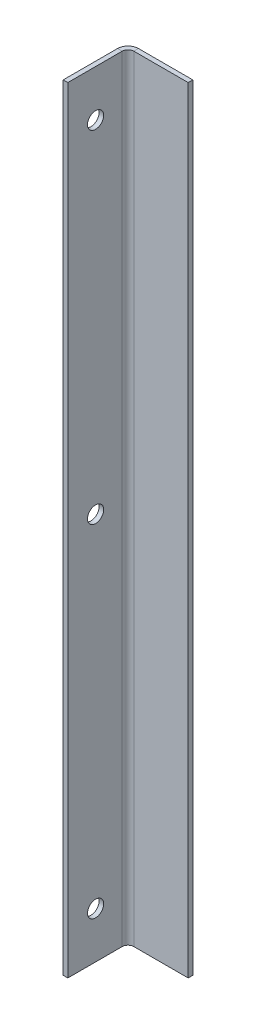
ISO-10303-21;
HEADER;
FILE_DESCRIPTION(('STEP AP214'),'2;1');
FILE_NAME('part.step','',(''),(''),'','','');
FILE_SCHEMA(('AUTOMOTIVE_DESIGN { 1 0 10303 214 1 1 1 1 }'));
ENDSEC;
DATA;
#1=APPLICATION_CONTEXT('core data for automotive mechanical design processes');
#2=APPLICATION_PROTOCOL_DEFINITION('international standard','automotive_design',2000,#1);
#3=PRODUCT_CONTEXT('',#1,'mechanical');
#4=PRODUCT('Part','Part','',(#3));
#5=PRODUCT_RELATED_PRODUCT_CATEGORY('part','',(#4));
#6=PRODUCT_DEFINITION_FORMATION('','',#4);
#7=PRODUCT_DEFINITION_CONTEXT('part definition',#1,'design');
#8=PRODUCT_DEFINITION('design','',#6,#7);
#9=PRODUCT_DEFINITION_SHAPE('','',#8);
#10=(LENGTH_UNIT() NAMED_UNIT(*) SI_UNIT(.MILLI.,.METRE.));
#11=(NAMED_UNIT(*) PLANE_ANGLE_UNIT() SI_UNIT($,.RADIAN.));
#12=(NAMED_UNIT(*) SI_UNIT($,.STERADIAN.) SOLID_ANGLE_UNIT());
#13=UNCERTAINTY_MEASURE_WITH_UNIT(LENGTH_MEASURE(1.E-05),#10,'distance_accuracy_value','');
#14=(GEOMETRIC_REPRESENTATION_CONTEXT(3) GLOBAL_UNCERTAINTY_ASSIGNED_CONTEXT((#13)) GLOBAL_UNIT_ASSIGNED_CONTEXT((#10,
#11,#12)) REPRESENTATION_CONTEXT('',''));
#15=CARTESIAN_POINT('',(0.,0.,0.));
#16=DIRECTION('',(0.,0.,1.));
#17=DIRECTION('',(1.,0.,0.));
#18=AXIS2_PLACEMENT_3D('',#15,#16,#17);
#19=CARTESIAN_POINT('',(-2.,167.5,14.));
#20=DIRECTION('',(0.,1.,0.));
#21=DIRECTION('',(0.,0.,1.));
#22=AXIS2_PLACEMENT_3D('',#19,#20,#21);
#23=PLANE('',#22);
#24=DIRECTION('',(0.,0.,1.));
#25=VECTOR('',#24,1.);
#26=CARTESIAN_POINT('',(0.,167.5,14.));
#27=LINE('',#26,#25);
#28=CARTESIAN_POINT('',(0.,167.5,-9.50000000000001));
#29=VERTEX_POINT('',#28);
#30=CARTESIAN_POINT('',(0.,167.5,14.));
#31=VERTEX_POINT('',#30);
#32=EDGE_CURVE('E109',#29,#31,#27,.T.);
#33=ORIENTED_EDGE('',*,*,#32,.F.);
#34=DIRECTION('',(-1.,0.,0.));
#35=VECTOR('',#34,1.);
#36=CARTESIAN_POINT('',(0.,167.5,-9.50000000000001));
#37=LINE('',#36,#35);
#38=CARTESIAN_POINT('',(-2.00000000000001,167.5,-9.50000000000001));
#39=VERTEX_POINT('',#38);
#40=EDGE_CURVE('E122',#29,#39,#37,.T.);
#41=ORIENTED_EDGE('',*,*,#40,.T.);
#42=DIRECTION('',(0.,0.,1.));
#43=VECTOR('',#42,1.);
#44=CARTESIAN_POINT('',(-2.,167.5,14.));
#45=LINE('',#44,#43);
#46=CARTESIAN_POINT('',(-2.,167.5,14.));
#47=VERTEX_POINT('',#46);
#48=EDGE_CURVE('E114',#39,#47,#45,.T.);
#49=ORIENTED_EDGE('',*,*,#48,.T.);
#50=DIRECTION('',(1.,0.,0.));
#51=VECTOR('',#50,1.);
#52=CARTESIAN_POINT('',(-2.,167.5,14.));
#53=LINE('',#52,#51);
#54=EDGE_CURVE('E64',#47,#31,#53,.T.);
#55=ORIENTED_EDGE('',*,*,#54,.T.);
#56=EDGE_LOOP('',(#33,#41,#49,#55));
#57=FACE_BOUND('',#56,.T.);
#58=ADVANCED_FACE('F61',(#57),#23,.T.);
#59=CARTESIAN_POINT('',(-2.,0.,0.));
#60=DIRECTION('',(-1.,0.,0.));
#61=DIRECTION('',(0.,0.,1.));
#62=AXIS2_PLACEMENT_3D('',#59,#60,#61);
#63=PLANE('',#62);
#64=CARTESIAN_POINT('',(-2.,4.44089209850063E-13,1.99999999999998));
#65=DIRECTION('',(-1.,0.,0.));
#66=DIRECTION('',(0.,0.,1.));
#67=AXIS2_PLACEMENT_3D('',#64,#65,#66);
#68=CIRCLE('',#67,3.5);
#69=CARTESIAN_POINT('',(-2.,4.44089209850063E-13,5.49999999999999));
#70=VERTEX_POINT('',#69);
#71=EDGE_CURVE('E189',#70,#70,#68,.T.);
#72=ORIENTED_EDGE('',*,*,#71,.F.);
#73=EDGE_LOOP('',(#72));
#74=FACE_BOUND('',#73,.T.);
#75=CARTESIAN_POINT('',(-2.,-147.5,1.99999999999998));
#76=DIRECTION('',(-1.,0.,0.));
#77=DIRECTION('',(0.,0.,1.));
#78=AXIS2_PLACEMENT_3D('',#75,#76,#77);
#79=CIRCLE('',#78,3.5);
#80=CARTESIAN_POINT('',(-2.,-147.5,5.49999999999999));
#81=VERTEX_POINT('',#80);
#82=EDGE_CURVE('E183',#81,#81,#79,.F.);
#83=ORIENTED_EDGE('',*,*,#82,.T.);
#84=EDGE_LOOP('',(#83));
#85=FACE_BOUND('',#84,.T.);
#86=CARTESIAN_POINT('',(-2.,147.5,1.99999999999998));
#87=DIRECTION('',(-1.,0.,0.));
#88=DIRECTION('',(0.,0.,1.));
#89=AXIS2_PLACEMENT_3D('',#86,#87,#88);
#90=CIRCLE('',#89,3.5);
#91=CARTESIAN_POINT('',(-2.,147.5,5.49999999999999));
#92=VERTEX_POINT('',#91);
#93=EDGE_CURVE('E147',#92,#92,#90,.T.);
#94=ORIENTED_EDGE('',*,*,#93,.F.);
#95=EDGE_LOOP('',(#94));
#96=FACE_BOUND('',#95,.T.);
#97=ORIENTED_EDGE('',*,*,#48,.F.);
#98=DIRECTION('',(0.,1.,0.));
#99=VECTOR('',#98,1.);
#100=CARTESIAN_POINT('',(-2.00000000000001,167.5,-9.50000000000001));
#101=LINE('',#100,#99);
#102=CARTESIAN_POINT('',(-2.,-167.5,-9.50000000000001));
#103=VERTEX_POINT('',#102);
#104=EDGE_CURVE('E139',#39,#103,#101,.F.);
#105=ORIENTED_EDGE('',*,*,#104,.T.);
#106=DIRECTION('',(0.,0.,-1.));
#107=VECTOR('',#106,1.);
#108=CARTESIAN_POINT('',(-2.,-167.5,14.));
#109=LINE('',#108,#107);
#110=CARTESIAN_POINT('',(-2.,-167.5,14.));
#111=VERTEX_POINT('',#110);
#112=EDGE_CURVE('E119',#111,#103,#109,.T.);
#113=ORIENTED_EDGE('',*,*,#112,.F.);
#114=DIRECTION('',(0.,-1.,0.));
#115=VECTOR('',#114,1.);
#116=CARTESIAN_POINT('',(-2.,-167.5,14.));
#117=LINE('',#116,#115);
#118=EDGE_CURVE('E99',#47,#111,#117,.T.);
#119=ORIENTED_EDGE('',*,*,#118,.F.);
#120=EDGE_LOOP('',(#97,#105,#113,#119));
#121=FACE_BOUND('',#120,.T.);
#122=ADVANCED_FACE('F200',(#74,#85,#96,#121),#63,.T.);
#123=CARTESIAN_POINT('',(0.,0.,0.));
#124=DIRECTION('',(-1.,0.,0.));
#125=DIRECTION('',(0.,0.,1.));
#126=AXIS2_PLACEMENT_3D('',#123,#124,#125);
#127=PLANE('',#126);
#128=CARTESIAN_POINT('',(0.,4.44089209850063E-13,1.99999999999998));
#129=DIRECTION('',(1.,0.,0.));
#130=DIRECTION('',(0.,0.,-1.));
#131=AXIS2_PLACEMENT_3D('',#128,#129,#130);
#132=CIRCLE('',#131,3.5);
#133=CARTESIAN_POINT('',(0.,4.44089209850063E-13,-1.50000000000002));
#134=VERTEX_POINT('',#133);
#135=EDGE_CURVE('E192',#134,#134,#132,.T.);
#136=ORIENTED_EDGE('',*,*,#135,.F.);
#137=EDGE_LOOP('',(#136));
#138=FACE_BOUND('',#137,.T.);
#139=CARTESIAN_POINT('',(0.,-147.5,1.99999999999998));
#140=DIRECTION('',(-1.,0.,0.));
#141=DIRECTION('',(0.,0.,-1.));
#142=AXIS2_PLACEMENT_3D('',#139,#140,#141);
#143=CIRCLE('',#142,3.5);
#144=CARTESIAN_POINT('',(0.,-147.5,-1.50000000000002));
#145=VERTEX_POINT('',#144);
#146=EDGE_CURVE('E186',#145,#145,#143,.T.);
#147=ORIENTED_EDGE('',*,*,#146,.T.);
#148=EDGE_LOOP('',(#147));
#149=FACE_BOUND('',#148,.T.);
#150=CARTESIAN_POINT('',(0.,147.5,1.99999999999998));
#151=DIRECTION('',(1.,0.,0.));
#152=DIRECTION('',(0.,0.,-1.));
#153=AXIS2_PLACEMENT_3D('',#150,#151,#152);
#154=CIRCLE('',#153,3.5);
#155=CARTESIAN_POINT('',(0.,147.5,-1.50000000000002));
#156=VERTEX_POINT('',#155);
#157=EDGE_CURVE('E180',#156,#156,#154,.T.);
#158=ORIENTED_EDGE('',*,*,#157,.F.);
#159=EDGE_LOOP('',(#158));
#160=FACE_BOUND('',#159,.T.);
#161=DIRECTION('',(0.,1.,0.));
#162=VECTOR('',#161,1.);
#163=CARTESIAN_POINT('',(0.,167.5,-9.50000000000001));
#164=LINE('',#163,#162);
#165=CARTESIAN_POINT('',(0.,-167.5,-9.50000000000001));
#166=VERTEX_POINT('',#165);
#167=EDGE_CURVE('E129',#29,#166,#164,.F.);
#168=ORIENTED_EDGE('',*,*,#167,.F.);
#169=ORIENTED_EDGE('',*,*,#32,.T.);
#170=DIRECTION('',(0.,-1.,0.));
#171=VECTOR('',#170,1.);
#172=CARTESIAN_POINT('',(0.,-167.5,14.));
#173=LINE('',#172,#171);
#174=CARTESIAN_POINT('',(0.,-167.5,14.));
#175=VERTEX_POINT('',#174);
#176=EDGE_CURVE('E97',#31,#175,#173,.T.);
#177=ORIENTED_EDGE('',*,*,#176,.T.);
#178=DIRECTION('',(0.,0.,-1.));
#179=VECTOR('',#178,1.);
#180=CARTESIAN_POINT('',(0.,-167.5,14.));
#181=LINE('',#180,#179);
#182=EDGE_CURVE('E106',#175,#166,#181,.T.);
#183=ORIENTED_EDGE('',*,*,#182,.T.);
#184=EDGE_LOOP('',(#168,#169,#177,#183));
#185=FACE_BOUND('',#184,.T.);
#186=ADVANCED_FACE('F104',(#138,#149,#160,#185),#127,.F.);
#187=CARTESIAN_POINT('',(-2.,-167.5,14.));
#188=DIRECTION('',(0.,-1.,0.));
#189=DIRECTION('',(0.,0.,-1.));
#190=AXIS2_PLACEMENT_3D('',#187,#188,#189);
#191=PLANE('',#190);
#192=DIRECTION('',(-1.,0.,0.));
#193=VECTOR('',#192,1.);
#194=CARTESIAN_POINT('',(0.,-167.5,-9.50000000000001));
#195=LINE('',#194,#193);
#196=EDGE_CURVE('E113',#166,#103,#195,.T.);
#197=ORIENTED_EDGE('',*,*,#196,.F.);
#198=ORIENTED_EDGE('',*,*,#182,.F.);
#199=DIRECTION('',(1.,0.,0.));
#200=VECTOR('',#199,1.);
#201=CARTESIAN_POINT('',(-2.,-167.5,14.));
#202=LINE('',#201,#200);
#203=EDGE_CURVE('E13',#111,#175,#202,.T.);
#204=ORIENTED_EDGE('',*,*,#203,.F.);
#205=ORIENTED_EDGE('',*,*,#112,.T.);
#206=EDGE_LOOP('',(#197,#198,#204,#205));
#207=FACE_BOUND('',#206,.T.);
#208=ADVANCED_FACE('F112',(#207),#191,.T.);
#209=CARTESIAN_POINT('',(-2.,-167.5,14.));
#210=DIRECTION('',(0.,0.,1.));
#211=DIRECTION('',(1.,0.,0.));
#212=AXIS2_PLACEMENT_3D('',#209,#210,#211);
#213=PLANE('',#212);
#214=ORIENTED_EDGE('',*,*,#176,.F.);
#215=ORIENTED_EDGE('',*,*,#54,.F.);
#216=ORIENTED_EDGE('',*,*,#118,.T.);
#217=ORIENTED_EDGE('',*,*,#203,.T.);
#218=EDGE_LOOP('',(#214,#215,#216,#217));
#219=FACE_BOUND('',#218,.T.);
#220=ADVANCED_FACE('F95',(#219),#213,.T.);
#221=CARTESIAN_POINT('',(2.49999999999999,-167.5,-9.50000000000001));
#222=DIRECTION('',(0.,-1.,0.));
#223=DIRECTION('',(0.,0.,-1.));
#224=AXIS2_PLACEMENT_3D('',#221,#222,#223);
#225=PLANE('',#224);
#226=DIRECTION('',(0.,0.,1.));
#227=VECTOR('',#226,1.);
#228=CARTESIAN_POINT('',(2.49999999999999,-167.5,-14.));
#229=LINE('',#228,#227);
#230=CARTESIAN_POINT('',(2.49999999999998,-167.5,-12.));
#231=VERTEX_POINT('',#230);
#232=CARTESIAN_POINT('',(2.49999999999998,-167.5,-14.));
#233=VERTEX_POINT('',#232);
#234=EDGE_CURVE('E143',#231,#233,#229,.F.);
#235=ORIENTED_EDGE('',*,*,#234,.F.);
#236=CARTESIAN_POINT('',(2.49999999999999,-167.5,-9.50000000000001));
#237=DIRECTION('',(0.,1.,0.));
#238=DIRECTION('',(0.,0.,1.));
#239=AXIS2_PLACEMENT_3D('',#236,#237,#238);
#240=CIRCLE('',#239,2.5);
#241=EDGE_CURVE('E133',#166,#231,#240,.F.);
#242=ORIENTED_EDGE('',*,*,#241,.F.);
#243=ORIENTED_EDGE('',*,*,#196,.T.);
#244=CARTESIAN_POINT('',(2.49999999999999,-167.5,-9.50000000000001));
#245=DIRECTION('',(0.,1.,0.));
#246=DIRECTION('',(0.,0.,1.));
#247=AXIS2_PLACEMENT_3D('',#244,#245,#246);
#248=CIRCLE('',#247,4.5);
#249=EDGE_CURVE('E75',#103,#233,#248,.F.);
#250=ORIENTED_EDGE('',*,*,#249,.T.);
#251=EDGE_LOOP('',(#235,#242,#243,#250));
#252=FACE_BOUND('',#251,.T.);
#253=ADVANCED_FACE('F280',(#252),#225,.T.);
#254=CARTESIAN_POINT('',(2.49999999999999,167.5,-9.50000000000001));
#255=DIRECTION('',(0.,-1.,0.));
#256=DIRECTION('',(0.,0.,-1.));
#257=AXIS2_PLACEMENT_3D('',#254,#255,#256);
#258=PLANE('',#257);
#259=CARTESIAN_POINT('',(2.49999999999999,167.5,-9.50000000000001));
#260=DIRECTION('',(0.,1.,0.));
#261=DIRECTION('',(0.,0.,1.));
#262=AXIS2_PLACEMENT_3D('',#259,#260,#261);
#263=CIRCLE('',#262,2.5);
#264=CARTESIAN_POINT('',(2.49999999999998,167.5,-12.));
#265=VERTEX_POINT('',#264);
#266=EDGE_CURVE('E126',#265,#29,#263,.T.);
#267=ORIENTED_EDGE('',*,*,#266,.F.);
#268=DIRECTION('',(0.,0.,1.));
#269=VECTOR('',#268,1.);
#270=CARTESIAN_POINT('',(2.49999999999999,167.5,-12.));
#271=LINE('',#270,#269);
#272=CARTESIAN_POINT('',(2.49999999999999,167.5,-14.));
#273=VERTEX_POINT('',#272);
#274=EDGE_CURVE('E150',#265,#273,#271,.F.);
#275=ORIENTED_EDGE('',*,*,#274,.T.);
#276=CARTESIAN_POINT('',(2.49999999999999,167.5,-9.50000000000001));
#277=DIRECTION('',(0.,1.,0.));
#278=DIRECTION('',(0.,0.,1.));
#279=AXIS2_PLACEMENT_3D('',#276,#277,#278);
#280=CIRCLE('',#279,4.5);
#281=EDGE_CURVE('E136',#273,#39,#280,.T.);
#282=ORIENTED_EDGE('',*,*,#281,.T.);
#283=ORIENTED_EDGE('',*,*,#40,.F.);
#284=EDGE_LOOP('',(#267,#275,#282,#283));
#285=FACE_BOUND('',#284,.T.);
#286=ADVANCED_FACE('F262',(#285),#258,.F.);
#287=CARTESIAN_POINT('',(2.49999999999999,167.5,-9.50000000000001));
#288=DIRECTION('',(0.,1.,0.));
#289=DIRECTION('',(0.,0.,-1.));
#290=AXIS2_PLACEMENT_3D('',#287,#288,#289);
#291=CYLINDRICAL_SURFACE('',#290,4.5);
#292=ORIENTED_EDGE('',*,*,#104,.F.);
#293=ORIENTED_EDGE('',*,*,#281,.F.);
#294=DIRECTION('',(0.,1.,0.));
#295=VECTOR('',#294,1.);
#296=CARTESIAN_POINT('',(2.49999999999999,-167.5,-14.));
#297=LINE('',#296,#295);
#298=EDGE_CURVE('E153',#273,#233,#297,.F.);
#299=ORIENTED_EDGE('',*,*,#298,.T.);
#300=ORIENTED_EDGE('',*,*,#249,.F.);
#301=EDGE_LOOP('',(#292,#293,#299,#300));
#302=FACE_BOUND('',#301,.T.);
#303=ADVANCED_FACE('F260',(#302),#291,.T.);
#304=CARTESIAN_POINT('',(2.49999999999999,167.5,-9.50000000000001));
#305=DIRECTION('',(0.,1.,0.));
#306=DIRECTION('',(0.,0.,-1.));
#307=AXIS2_PLACEMENT_3D('',#304,#305,#306);
#308=CYLINDRICAL_SURFACE('',#307,2.5);
#309=ORIENTED_EDGE('',*,*,#167,.T.);
#310=ORIENTED_EDGE('',*,*,#241,.T.);
#311=DIRECTION('',(0.,1.,0.));
#312=VECTOR('',#311,1.);
#313=CARTESIAN_POINT('',(2.49999999999999,-167.5,-12.));
#314=LINE('',#313,#312);
#315=EDGE_CURVE('E146',#231,#265,#314,.T.);
#316=ORIENTED_EDGE('',*,*,#315,.T.);
#317=ORIENTED_EDGE('',*,*,#266,.T.);
#318=EDGE_LOOP('',(#309,#310,#316,#317));
#319=FACE_BOUND('',#318,.T.);
#320=ADVANCED_FACE('F279',(#319),#308,.F.);
#321=CARTESIAN_POINT('',(26.,167.5,-14.0000000000001));
#322=DIRECTION('',(0.,-1.,0.));
#323=DIRECTION('',(0.,0.,-1.));
#324=AXIS2_PLACEMENT_3D('',#321,#322,#323);
#325=PLANE('',#324);
#326=ORIENTED_EDGE('',*,*,#274,.F.);
#327=DIRECTION('',(-1.,0.,0.));
#328=VECTOR('',#327,1.);
#329=CARTESIAN_POINT('',(26.,167.5,-12.0000000000001));
#330=LINE('',#329,#328);
#331=CARTESIAN_POINT('',(26.,167.5,-12.0000000000001));
#332=VERTEX_POINT('',#331);
#333=EDGE_CURVE('E155',#265,#332,#330,.F.);
#334=ORIENTED_EDGE('',*,*,#333,.T.);
#335=DIRECTION('',(0.,0.,1.));
#336=VECTOR('',#335,1.);
#337=CARTESIAN_POINT('',(26.,167.5,-14.0000000000001));
#338=LINE('',#337,#336);
#339=CARTESIAN_POINT('',(26.,167.5,-14.0000000000001));
#340=VERTEX_POINT('',#339);
#341=EDGE_CURVE('E130',#340,#332,#338,.T.);
#342=ORIENTED_EDGE('',*,*,#341,.F.);
#343=DIRECTION('',(1.,0.,0.));
#344=VECTOR('',#343,1.);
#345=CARTESIAN_POINT('',(0.,167.5,-14.));
#346=LINE('',#345,#344);
#347=EDGE_CURVE('E164',#273,#340,#346,.T.);
#348=ORIENTED_EDGE('',*,*,#347,.F.);
#349=EDGE_LOOP('',(#326,#334,#342,#348));
#350=FACE_BOUND('',#349,.T.);
#351=ADVANCED_FACE('F271',(#350),#325,.F.);
#352=CARTESIAN_POINT('',(0.,-167.5,-14.));
#353=DIRECTION('',(0.,1.,0.));
#354=DIRECTION('',(0.,0.,1.));
#355=AXIS2_PLACEMENT_3D('',#352,#353,#354);
#356=PLANE('',#355);
#357=ORIENTED_EDGE('',*,*,#234,.T.);
#358=DIRECTION('',(-1.,0.,0.));
#359=VECTOR('',#358,1.);
#360=CARTESIAN_POINT('',(0.,-167.5,-14.));
#361=LINE('',#360,#359);
#362=CARTESIAN_POINT('',(26.,-167.5,-14.0000000000001));
#363=VERTEX_POINT('',#362);
#364=EDGE_CURVE('E170',#363,#233,#361,.T.);
#365=ORIENTED_EDGE('',*,*,#364,.F.);
#366=DIRECTION('',(0.,0.,1.));
#367=VECTOR('',#366,1.);
#368=CARTESIAN_POINT('',(26.,-167.5,-14.0000000000001));
#369=LINE('',#368,#367);
#370=CARTESIAN_POINT('',(26.,-167.5,-12.0000000000001));
#371=VERTEX_POINT('',#370);
#372=EDGE_CURVE('E173',#363,#371,#369,.T.);
#373=ORIENTED_EDGE('',*,*,#372,.T.);
#374=DIRECTION('',(1.,0.,0.));
#375=VECTOR('',#374,1.);
#376=CARTESIAN_POINT('',(0.,-167.5,-12.));
#377=LINE('',#376,#375);
#378=EDGE_CURVE('E161',#371,#231,#377,.F.);
#379=ORIENTED_EDGE('',*,*,#378,.T.);
#380=EDGE_LOOP('',(#357,#365,#373,#379));
#381=FACE_BOUND('',#380,.T.);
#382=ADVANCED_FACE('F275',(#381),#356,.F.);
#383=CARTESIAN_POINT('',(0.,0.,-14.));
#384=DIRECTION('',(0.,0.,1.));
#385=DIRECTION('',(1.,0.,0.));
#386=AXIS2_PLACEMENT_3D('',#383,#384,#385);
#387=PLANE('',#386);
#388=ORIENTED_EDGE('',*,*,#298,.F.);
#389=ORIENTED_EDGE('',*,*,#347,.T.);
#390=DIRECTION('',(0.,-1.,0.));
#391=VECTOR('',#390,1.);
#392=CARTESIAN_POINT('',(26.,0.,-14.0000000000001));
#393=LINE('',#392,#391);
#394=EDGE_CURVE('E167',#340,#363,#393,.T.);
#395=ORIENTED_EDGE('',*,*,#394,.T.);
#396=ORIENTED_EDGE('',*,*,#364,.T.);
#397=EDGE_LOOP('',(#388,#389,#395,#396));
#398=FACE_BOUND('',#397,.T.);
#399=ADVANCED_FACE('F268',(#398),#387,.F.);
#400=CARTESIAN_POINT('',(0.,0.,-12.));
#401=DIRECTION('',(0.,0.,1.));
#402=DIRECTION('',(1.,0.,0.));
#403=AXIS2_PLACEMENT_3D('',#400,#401,#402);
#404=PLANE('',#403);
#405=ORIENTED_EDGE('',*,*,#333,.F.);
#406=ORIENTED_EDGE('',*,*,#315,.F.);
#407=ORIENTED_EDGE('',*,*,#378,.F.);
#408=DIRECTION('',(0.,1.,0.));
#409=VECTOR('',#408,1.);
#410=CARTESIAN_POINT('',(26.,-167.5,-12.0000000000001));
#411=LINE('',#410,#409);
#412=EDGE_CURVE('E158',#332,#371,#411,.F.);
#413=ORIENTED_EDGE('',*,*,#412,.F.);
#414=EDGE_LOOP('',(#405,#406,#407,#413));
#415=FACE_BOUND('',#414,.T.);
#416=ADVANCED_FACE('F218',(#415),#404,.T.);
#417=CARTESIAN_POINT('',(26.,-167.5,-14.0000000000001));
#418=DIRECTION('',(-1.,0.,0.));
#419=DIRECTION('',(0.,0.,1.));
#420=AXIS2_PLACEMENT_3D('',#417,#418,#419);
#421=PLANE('',#420);
#422=ORIENTED_EDGE('',*,*,#412,.T.);
#423=ORIENTED_EDGE('',*,*,#372,.F.);
#424=ORIENTED_EDGE('',*,*,#394,.F.);
#425=ORIENTED_EDGE('',*,*,#341,.T.);
#426=EDGE_LOOP('',(#422,#423,#424,#425));
#427=FACE_BOUND('',#426,.T.);
#428=ADVANCED_FACE('F209',(#427),#421,.F.);
#429=CARTESIAN_POINT('',(-10.,147.5,1.99999999999998));
#430=DIRECTION('',(1.,0.,0.));
#431=DIRECTION('',(0.,0.,-1.));
#432=AXIS2_PLACEMENT_3D('',#429,#430,#431);
#433=CYLINDRICAL_SURFACE('',#432,3.5);
#434=ORIENTED_EDGE('',*,*,#93,.T.);
#435=EDGE_LOOP('',(#434));
#436=FACE_BOUND('',#435,.T.);
#437=ORIENTED_EDGE('',*,*,#157,.T.);
#438=EDGE_LOOP('',(#437));
#439=FACE_BOUND('',#438,.T.);
#440=ADVANCED_FACE('F206',(#436,#439),#433,.F.);
#441=CARTESIAN_POINT('',(-10.,-147.5,1.99999999999998));
#442=DIRECTION('',(1.,0.,0.));
#443=DIRECTION('',(0.,0.,-1.));
#444=AXIS2_PLACEMENT_3D('',#441,#442,#443);
#445=CYLINDRICAL_SURFACE('',#444,3.5);
#446=ORIENTED_EDGE('',*,*,#82,.F.);
#447=EDGE_LOOP('',(#446));
#448=FACE_BOUND('',#447,.T.);
#449=ORIENTED_EDGE('',*,*,#146,.F.);
#450=EDGE_LOOP('',(#449));
#451=FACE_BOUND('',#450,.T.);
#452=ADVANCED_FACE('F208',(#448,#451),#445,.F.);
#453=CARTESIAN_POINT('',(-10.,4.44089209850063E-13,1.99999999999998));
#454=DIRECTION('',(1.,0.,0.));
#455=DIRECTION('',(0.,0.,-1.));
#456=AXIS2_PLACEMENT_3D('',#453,#454,#455);
#457=CYLINDRICAL_SURFACE('',#456,3.5);
#458=ORIENTED_EDGE('',*,*,#71,.T.);
#459=EDGE_LOOP('',(#458));
#460=FACE_BOUND('',#459,.T.);
#461=ORIENTED_EDGE('',*,*,#135,.T.);
#462=EDGE_LOOP('',(#461));
#463=FACE_BOUND('',#462,.T.);
#464=ADVANCED_FACE('F196',(#460,#463),#457,.F.);
#465=CLOSED_SHELL('',(#58,#122,#186,#208,#220,#253,#286,#303,#320,#351,#382,#399,#416,#428,#440,
#452,#464));
#466=MANIFOLD_SOLID_BREP('B2',#465);
#467=ADVANCED_BREP_SHAPE_REPRESENTATION('',(#18,#466),#14);
#468=SHAPE_DEFINITION_REPRESENTATION(#9,#467);
ENDSEC;
END-ISO-10303-21;
